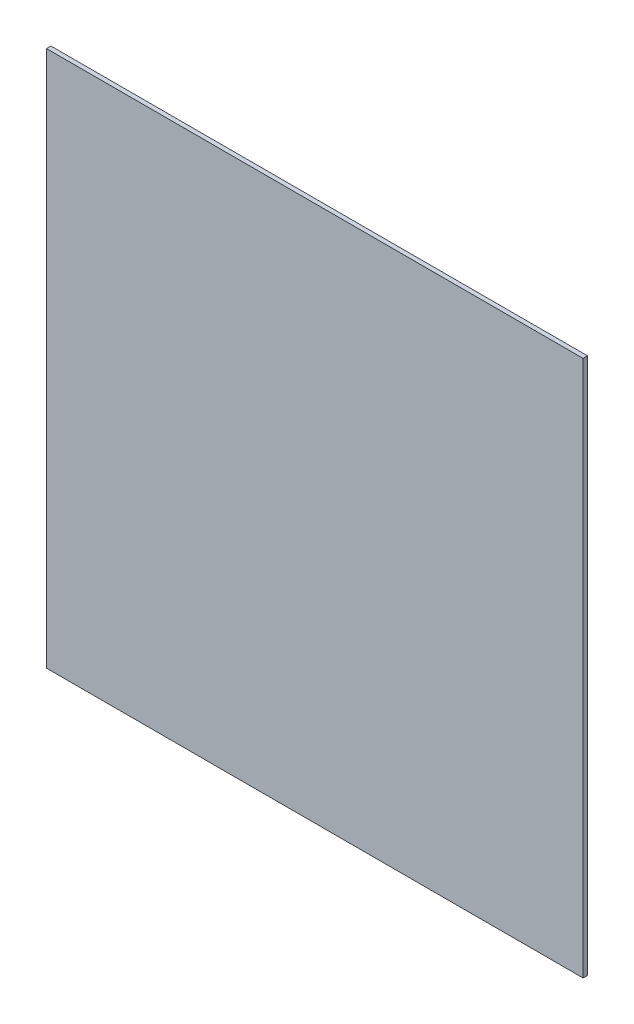
ISO-10303-21;
HEADER;
FILE_DESCRIPTION(('STEP AP214'),'2;1');
FILE_NAME('part.step','',(''),(''),'','','');
FILE_SCHEMA(('AUTOMOTIVE_DESIGN { 1 0 10303 214 1 1 1 1 }'));
ENDSEC;
DATA;
#1=APPLICATION_CONTEXT('core data for automotive mechanical design processes');
#2=APPLICATION_PROTOCOL_DEFINITION('international standard','automotive_design',2000,#1);
#3=PRODUCT_CONTEXT('',#1,'mechanical');
#4=PRODUCT('Part','Part','',(#3));
#5=PRODUCT_RELATED_PRODUCT_CATEGORY('part','',(#4));
#6=PRODUCT_DEFINITION_FORMATION('','',#4);
#7=PRODUCT_DEFINITION_CONTEXT('part definition',#1,'design');
#8=PRODUCT_DEFINITION('design','',#6,#7);
#9=PRODUCT_DEFINITION_SHAPE('','',#8);
#10=(LENGTH_UNIT() NAMED_UNIT(*) SI_UNIT(.MILLI.,.METRE.));
#11=(NAMED_UNIT(*) PLANE_ANGLE_UNIT() SI_UNIT($,.RADIAN.));
#12=(NAMED_UNIT(*) SI_UNIT($,.STERADIAN.) SOLID_ANGLE_UNIT());
#13=UNCERTAINTY_MEASURE_WITH_UNIT(LENGTH_MEASURE(1.E-05),#10,'distance_accuracy_value','');
#14=(GEOMETRIC_REPRESENTATION_CONTEXT(3) GLOBAL_UNCERTAINTY_ASSIGNED_CONTEXT((#13)) GLOBAL_UNIT_ASSIGNED_CONTEXT((#10,
#11,#12)) REPRESENTATION_CONTEXT('',''));
#15=CARTESIAN_POINT('',(0.,0.,0.));
#16=DIRECTION('',(0.,0.,1.));
#17=DIRECTION('',(1.,0.,0.));
#18=AXIS2_PLACEMENT_3D('',#15,#16,#17);
#19=CARTESIAN_POINT('',(0.,0.,0.41148));
#20=DIRECTION('',(0.,0.,1.));
#21=DIRECTION('',(1.,0.,0.));
#22=AXIS2_PLACEMENT_3D('',#19,#20,#21);
#23=PLANE('',#22);
#24=DIRECTION('',(1.015999399968E-07,0.999999999999995,0.));
#25=VECTOR('',#24,1.);
#26=CARTESIAN_POINT('',(49.99997366,0.,0.41148));
#27=LINE('',#26,#25);
#28=CARTESIAN_POINT('',(49.99997366,0.,0.41148));
#29=VERTEX_POINT('',#28);
#30=CARTESIAN_POINT('',(49.99996858,-50.00002954,0.41148));
#31=VERTEX_POINT('',#30);
#32=EDGE_CURVE('E20',#29,#31,#27,.F.);
#33=ORIENTED_EDGE('',*,*,#32,.F.);
#34=DIRECTION('',(1.,0.,0.));
#35=VECTOR('',#34,1.);
#36=CARTESIAN_POINT('',(0.,0.,0.41148));
#37=LINE('',#36,#35);
#38=CARTESIAN_POINT('',(0.,0.,0.41148));
#39=VERTEX_POINT('',#38);
#40=EDGE_CURVE('E53',#39,#29,#37,.T.);
#41=ORIENTED_EDGE('',*,*,#40,.F.);
#42=DIRECTION('',(-6.09599639848287E-07,-0.999999999999814,0.));
#43=VECTOR('',#42,1.);
#44=CARTESIAN_POINT('',(-3.048E-05,-50.00002954,0.41148));
#45=LINE('',#44,#43);
#46=CARTESIAN_POINT('',(-3.0480000002072E-05,-50.00002954,0.41148));
#47=VERTEX_POINT('',#46);
#48=EDGE_CURVE('E79',#47,#39,#45,.F.);
#49=ORIENTED_EDGE('',*,*,#48,.F.);
#50=DIRECTION('',(1.,0.,0.));
#51=VECTOR('',#50,1.);
#52=CARTESIAN_POINT('',(49.99996858,-50.00002954,0.41148));
#53=LINE('',#52,#51);
#54=EDGE_CURVE('E62',#31,#47,#53,.F.);
#55=ORIENTED_EDGE('',*,*,#54,.F.);
#56=EDGE_LOOP('',(#33,#41,#49,#55));
#57=FACE_BOUND('',#56,.T.);
#58=ADVANCED_FACE('F17',(#57),#23,.T.);
#59=CARTESIAN_POINT('',(-3.048E-05,-50.00002954,0.));
#60=DIRECTION('',(-0.999999999999814,6.09599639848287E-07,0.));
#61=DIRECTION('',(-6.09599639848287E-07,-0.999999999999814,0.));
#62=AXIS2_PLACEMENT_3D('',#59,#60,#61);
#63=PLANE('',#62);
#64=DIRECTION('',(0.,0.,1.));
#65=VECTOR('',#64,1.);
#66=CARTESIAN_POINT('',(0.,0.,0.));
#67=LINE('',#66,#65);
#68=CARTESIAN_POINT('',(0.,0.,0.));
#69=VERTEX_POINT('',#68);
#70=EDGE_CURVE('E57',#69,#39,#67,.T.);
#71=ORIENTED_EDGE('',*,*,#70,.F.);
#72=DIRECTION('',(-6.09599639848419E-07,-0.999999999999814,0.));
#73=VECTOR('',#72,1.);
#74=CARTESIAN_POINT('',(0.,0.,0.));
#75=LINE('',#74,#73);
#76=CARTESIAN_POINT('',(-3.0480000000777E-05,-50.00002954,0.));
#77=VERTEX_POINT('',#76);
#78=EDGE_CURVE('E70',#69,#77,#75,.T.);
#79=ORIENTED_EDGE('',*,*,#78,.T.);
#80=DIRECTION('',(0.,0.,-1.));
#81=VECTOR('',#80,1.);
#82=CARTESIAN_POINT('',(-3.0480000003108E-05,-50.00002954,0.));
#83=LINE('',#82,#81);
#84=EDGE_CURVE('E66',#47,#77,#83,.T.);
#85=ORIENTED_EDGE('',*,*,#84,.F.);
#86=ORIENTED_EDGE('',*,*,#48,.T.);
#87=EDGE_LOOP('',(#71,#79,#85,#86));
#88=FACE_BOUND('',#87,.T.);
#89=ADVANCED_FACE('F102',(#88),#63,.T.);
#90=CARTESIAN_POINT('',(49.99996858,-50.00002954,0.));
#91=DIRECTION('',(0.,-1.,0.));
#92=DIRECTION('',(0.,0.,-1.));
#93=AXIS2_PLACEMENT_3D('',#90,#91,#92);
#94=PLANE('',#93);
#95=ORIENTED_EDGE('',*,*,#84,.T.);
#96=DIRECTION('',(1.,0.,0.));
#97=VECTOR('',#96,1.);
#98=CARTESIAN_POINT('',(0.,-50.00002954,0.));
#99=LINE('',#98,#97);
#100=CARTESIAN_POINT('',(49.99996858,-50.00002954,0.));
#101=VERTEX_POINT('',#100);
#102=EDGE_CURVE('E73',#77,#101,#99,.T.);
#103=ORIENTED_EDGE('',*,*,#102,.T.);
#104=DIRECTION('',(0.,0.,1.));
#105=VECTOR('',#104,1.);
#106=CARTESIAN_POINT('',(49.99996858,-50.00002954,0.));
#107=LINE('',#106,#105);
#108=EDGE_CURVE('E65',#31,#101,#107,.F.);
#109=ORIENTED_EDGE('',*,*,#108,.F.);
#110=ORIENTED_EDGE('',*,*,#54,.T.);
#111=EDGE_LOOP('',(#95,#103,#109,#110));
#112=FACE_BOUND('',#111,.T.);
#113=ADVANCED_FACE('F97',(#112),#94,.T.);
#114=CARTESIAN_POINT('',(49.99997366,0.,0.));
#115=DIRECTION('',(0.999999999999995,-1.015999399968E-07,0.));
#116=DIRECTION('',(1.015999399968E-07,0.999999999999995,0.));
#117=AXIS2_PLACEMENT_3D('',#114,#115,#116);
#118=PLANE('',#117);
#119=ORIENTED_EDGE('',*,*,#108,.T.);
#120=DIRECTION('',(0.,1.,0.));
#121=VECTOR('',#120,1.);
#122=CARTESIAN_POINT('',(49.99996858,0.,0.));
#123=LINE('',#122,#121);
#124=CARTESIAN_POINT('',(49.99997239,0.,0.));
#125=VERTEX_POINT('',#124);
#126=EDGE_CURVE('E26',#101,#125,#123,.T.);
#127=ORIENTED_EDGE('',*,*,#126,.T.);
#128=DIRECTION('',(0.,0.,1.));
#129=VECTOR('',#128,1.);
#130=CARTESIAN_POINT('',(49.99997366,0.,0.));
#131=LINE('',#130,#129);
#132=EDGE_CURVE('E34',#29,#125,#131,.F.);
#133=ORIENTED_EDGE('',*,*,#132,.F.);
#134=ORIENTED_EDGE('',*,*,#32,.T.);
#135=EDGE_LOOP('',(#119,#127,#133,#134));
#136=FACE_BOUND('',#135,.T.);
#137=ADVANCED_FACE('F68',(#136),#118,.T.);
#138=CARTESIAN_POINT('',(0.,0.,0.));
#139=DIRECTION('',(0.,1.,0.));
#140=DIRECTION('',(0.,0.,1.));
#141=AXIS2_PLACEMENT_3D('',#138,#139,#140);
#142=PLANE('',#141);
#143=ORIENTED_EDGE('',*,*,#132,.T.);
#144=DIRECTION('',(1.,0.,0.));
#145=VECTOR('',#144,1.);
#146=CARTESIAN_POINT('',(0.,0.,0.));
#147=LINE('',#146,#145);
#148=EDGE_CURVE('E11',#125,#69,#147,.F.);
#149=ORIENTED_EDGE('',*,*,#148,.T.);
#150=ORIENTED_EDGE('',*,*,#70,.T.);
#151=ORIENTED_EDGE('',*,*,#40,.T.);
#152=EDGE_LOOP('',(#143,#149,#150,#151));
#153=FACE_BOUND('',#152,.T.);
#154=ADVANCED_FACE('F55',(#153),#142,.T.);
#155=CARTESIAN_POINT('',(0.,0.,0.));
#156=DIRECTION('',(0.,0.,1.));
#157=DIRECTION('',(1.,0.,0.));
#158=AXIS2_PLACEMENT_3D('',#155,#156,#157);
#159=PLANE('',#158);
#160=ORIENTED_EDGE('',*,*,#126,.F.);
#161=ORIENTED_EDGE('',*,*,#102,.F.);
#162=ORIENTED_EDGE('',*,*,#78,.F.);
#163=ORIENTED_EDGE('',*,*,#148,.F.);
#164=EDGE_LOOP('',(#160,#161,#162,#163));
#165=FACE_BOUND('',#164,.T.);
#166=ADVANCED_FACE('F100',(#165),#159,.F.);
#167=CLOSED_SHELL('',(#58,#89,#113,#137,#154,#166));
#168=MANIFOLD_SOLID_BREP('B1',#167);
#169=ADVANCED_BREP_SHAPE_REPRESENTATION('',(#18,#168),#14);
#170=SHAPE_DEFINITION_REPRESENTATION(#9,#169);
ENDSEC;
END-ISO-10303-21;
